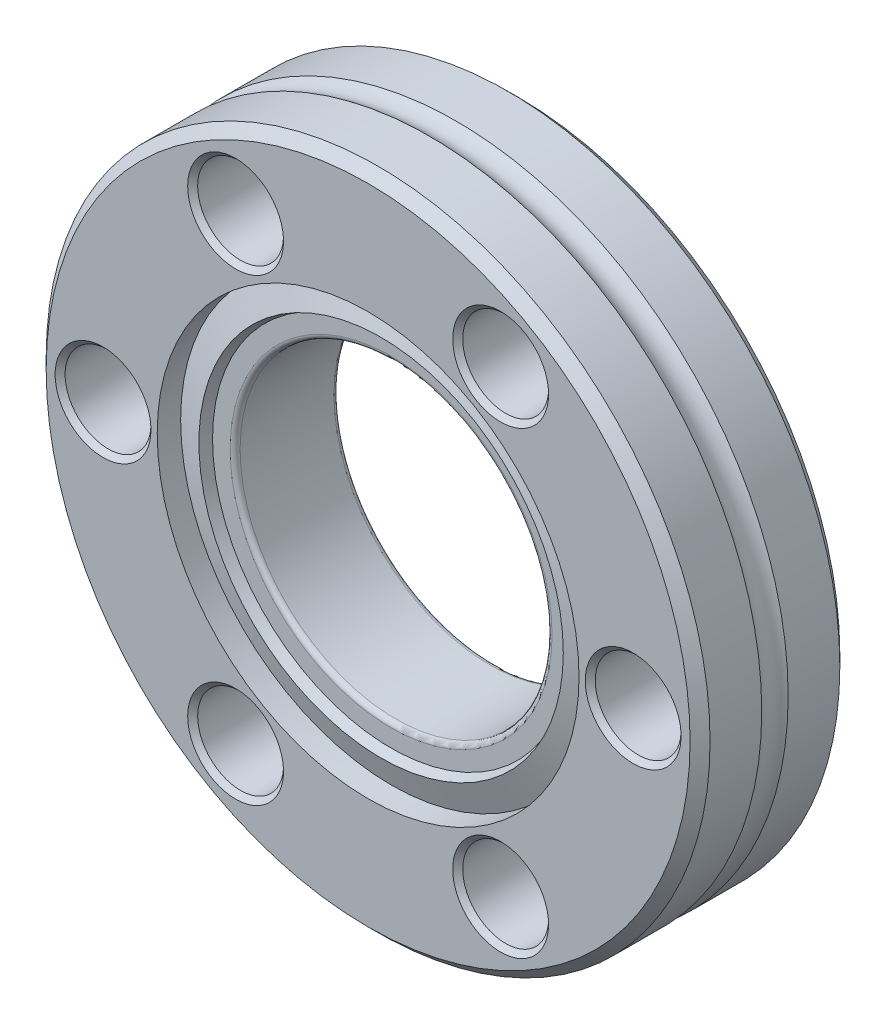
ISO-10303-21;
HEADER;
FILE_DESCRIPTION(('STEP AP214'),'2;1');
FILE_NAME('part.step','',(''),(''),'','','');
FILE_SCHEMA(('AUTOMOTIVE_DESIGN { 1 0 10303 214 1 1 1 1 }'));
ENDSEC;
DATA;
#1=APPLICATION_CONTEXT('core data for automotive mechanical design processes');
#2=APPLICATION_PROTOCOL_DEFINITION('international standard','automotive_design',2000,#1);
#3=PRODUCT_CONTEXT('',#1,'mechanical');
#4=PRODUCT('Part','Part','',(#3));
#5=PRODUCT_RELATED_PRODUCT_CATEGORY('part','',(#4));
#6=PRODUCT_DEFINITION_FORMATION('','',#4);
#7=PRODUCT_DEFINITION_CONTEXT('part definition',#1,'design');
#8=PRODUCT_DEFINITION('design','',#6,#7);
#9=PRODUCT_DEFINITION_SHAPE('','',#8);
#10=(LENGTH_UNIT() NAMED_UNIT(*) SI_UNIT(.MILLI.,.METRE.));
#11=(NAMED_UNIT(*) PLANE_ANGLE_UNIT() SI_UNIT($,.RADIAN.));
#12=(NAMED_UNIT(*) SI_UNIT($,.STERADIAN.) SOLID_ANGLE_UNIT());
#13=UNCERTAINTY_MEASURE_WITH_UNIT(LENGTH_MEASURE(1.E-05),#10,'distance_accuracy_value','');
#14=(GEOMETRIC_REPRESENTATION_CONTEXT(3) GLOBAL_UNCERTAINTY_ASSIGNED_CONTEXT((#13)) GLOBAL_UNIT_ASSIGNED_CONTEXT((#10,
#11,#12)) REPRESENTATION_CONTEXT('',''));
#15=CARTESIAN_POINT('',(0.,0.,0.));
#16=DIRECTION('',(0.,0.,1.));
#17=DIRECTION('',(1.,0.,0.));
#18=AXIS2_PLACEMENT_3D('',#15,#16,#17);
#19=CARTESIAN_POINT('',(0.,0.,3.81));
#20=DIRECTION('',(0.,0.,1.));
#21=DIRECTION('',(-1.,0.,0.));
#22=AXIS2_PLACEMENT_3D('',#19,#20,#21);
#23=CYLINDRICAL_SURFACE('',#22,16.891);
#24=CARTESIAN_POINT('',(0.,0.,-0.67202083301042));
#25=DIRECTION('',(0.,0.,-1.));
#26=DIRECTION('',(-1.,0.,0.));
#27=AXIS2_PLACEMENT_3D('',#24,#25,#26);
#28=CIRCLE('',#27,16.891);
#29=CARTESIAN_POINT('',(-16.891,0.,-0.67202083301042));
#30=VERTEX_POINT('',#29);
#31=EDGE_CURVE('E11',#30,#30,#28,.T.);
#32=ORIENTED_EDGE('',*,*,#31,.T.);
#33=EDGE_LOOP('',(#32));
#34=FACE_BOUND('',#33,.T.);
#35=CARTESIAN_POINT('',(0.,0.,-3.302));
#36=DIRECTION('',(0.,0.,1.));
#37=DIRECTION('',(-1.,0.,0.));
#38=AXIS2_PLACEMENT_3D('',#35,#36,#37);
#39=CIRCLE('',#38,16.891);
#40=CARTESIAN_POINT('',(-16.891,0.,-3.302));
#41=VERTEX_POINT('',#40);
#42=EDGE_CURVE('E28',#41,#41,#39,.T.);
#43=ORIENTED_EDGE('',*,*,#42,.T.);
#44=EDGE_LOOP('',(#43));
#45=FACE_BOUND('',#44,.T.);
#46=ADVANCED_FACE('F17',(#34,#45),#23,.T.);
#47=CARTESIAN_POINT('',(6.7437,-11.6804310310023,3.81));
#48=DIRECTION('',(0.,0.,1.));
#49=DIRECTION('',(0.5,-0.866025403784439,0.));
#50=AXIS2_PLACEMENT_3D('',#47,#48,#49);
#51=CONICAL_SURFACE('',#50,2.4384,0.785398163397442);
#52=CARTESIAN_POINT('',(6.7437,-11.6804310310023,3.81));
#53=DIRECTION('',(0.,0.,-1.));
#54=DIRECTION('',(-0.5,0.866025403784439,0.));
#55=AXIS2_PLACEMENT_3D('',#52,#53,#54);
#56=CIRCLE('',#55,2.4384);
#57=CARTESIAN_POINT('',(5.5245,-9.56871468641428,3.81));
#58=VERTEX_POINT('',#57);
#59=EDGE_CURVE('E288',#58,#58,#56,.T.);
#60=ORIENTED_EDGE('',*,*,#59,.F.);
#61=EDGE_LOOP('',(#60));
#62=FACE_BOUND('',#61,.T.);
#63=CARTESIAN_POINT('',(6.7437,-11.6804310310023,3.556));
#64=DIRECTION('',(0.,0.,1.));
#65=DIRECTION('',(-0.5,0.866025403784439,0.));
#66=AXIS2_PLACEMENT_3D('',#63,#64,#65);
#67=CIRCLE('',#66,2.1844);
#68=CARTESIAN_POINT('',(5.6515,-9.78868513897552,3.556));
#69=VERTEX_POINT('',#68);
#70=EDGE_CURVE('E205',#69,#69,#67,.T.);
#71=ORIENTED_EDGE('',*,*,#70,.F.);
#72=EDGE_LOOP('',(#71));
#73=FACE_BOUND('',#72,.T.);
#74=ADVANCED_FACE('F398',(#62,#73),#51,.F.);
#75=CARTESIAN_POINT('',(0.,0.,0.));
#76=DIRECTION('',(0.,0.,-1.));
#77=DIRECTION('',(-1.,0.,0.));
#78=AXIS2_PLACEMENT_3D('',#75,#76,#77);
#79=TOROIDAL_SURFACE('',#78,17.653,1.016);
#80=CARTESIAN_POINT('',(0.,0.,0.67202083301042));
#81=DIRECTION('',(0.,0.,-1.));
#82=DIRECTION('',(-1.,0.,0.));
#83=AXIS2_PLACEMENT_3D('',#80,#81,#82);
#84=CIRCLE('',#83,16.891);
#85=CARTESIAN_POINT('',(-16.891,0.,0.67202083301042));
#86=VERTEX_POINT('',#85);
#87=EDGE_CURVE('E235',#86,#86,#84,.T.);
#88=ORIENTED_EDGE('',*,*,#87,.T.);
#89=EDGE_LOOP('',(#88));
#90=FACE_BOUND('',#89,.T.);
#91=ORIENTED_EDGE('',*,*,#31,.F.);
#92=EDGE_LOOP('',(#91));
#93=FACE_BOUND('',#92,.T.);
#94=ADVANCED_FACE('F353',(#90,#93),#79,.F.);
#95=CARTESIAN_POINT('',(0.,0.,3.302));
#96=DIRECTION('',(0.,0.,-1.));
#97=DIRECTION('',(-1.,0.,0.));
#98=AXIS2_PLACEMENT_3D('',#95,#96,#97);
#99=CONICAL_SURFACE('',#98,16.891,0.78539816339745);
#100=CARTESIAN_POINT('',(0.,0.,3.302));
#101=DIRECTION('',(0.,0.,-1.));
#102=DIRECTION('',(-1.,0.,0.));
#103=AXIS2_PLACEMENT_3D('',#100,#101,#102);
#104=CIRCLE('',#103,16.891);
#105=CARTESIAN_POINT('',(-16.891,0.,3.302));
#106=VERTEX_POINT('',#105);
#107=EDGE_CURVE('E231',#106,#106,#104,.T.);
#108=ORIENTED_EDGE('',*,*,#107,.F.);
#109=EDGE_LOOP('',(#108));
#110=FACE_BOUND('',#109,.T.);
#111=CARTESIAN_POINT('',(0.,0.,3.81));
#112=DIRECTION('',(0.,0.,1.));
#113=DIRECTION('',(-1.,0.,0.));
#114=AXIS2_PLACEMENT_3D('',#111,#112,#113);
#115=CIRCLE('',#114,16.383);
#116=CARTESIAN_POINT('',(-16.383,0.,3.81));
#117=VERTEX_POINT('',#116);
#118=EDGE_CURVE('E283',#117,#117,#115,.T.);
#119=ORIENTED_EDGE('',*,*,#118,.F.);
#120=EDGE_LOOP('',(#119));
#121=FACE_BOUND('',#120,.T.);
#122=ADVANCED_FACE('F362',(#110,#121),#99,.T.);
#123=CARTESIAN_POINT('',(13.4874,0.,-3.81));
#124=DIRECTION('',(0.,0.,-1.));
#125=DIRECTION('',(-1.,0.,0.));
#126=AXIS2_PLACEMENT_3D('',#123,#124,#125);
#127=CONICAL_SURFACE('',#126,2.4384,0.785398163397442);
#128=CARTESIAN_POINT('',(13.4874,0.,-3.81));
#129=DIRECTION('',(0.,0.,1.));
#130=DIRECTION('',(-1.,0.,0.));
#131=AXIS2_PLACEMENT_3D('',#128,#129,#130);
#132=CIRCLE('',#131,2.4384);
#133=CARTESIAN_POINT('',(11.049,0.,-3.81));
#134=VERTEX_POINT('',#133);
#135=EDGE_CURVE('E260',#134,#134,#132,.T.);
#136=ORIENTED_EDGE('',*,*,#135,.F.);
#137=EDGE_LOOP('',(#136));
#138=FACE_BOUND('',#137,.T.);
#139=CARTESIAN_POINT('',(13.4874,0.,-3.556));
#140=DIRECTION('',(0.,0.,-1.));
#141=DIRECTION('',(-1.,0.,0.));
#142=AXIS2_PLACEMENT_3D('',#139,#140,#141);
#143=CIRCLE('',#142,2.1844);
#144=CARTESIAN_POINT('',(11.303,0.,-3.556));
#145=VERTEX_POINT('',#144);
#146=EDGE_CURVE('E194',#145,#145,#143,.T.);
#147=ORIENTED_EDGE('',*,*,#146,.F.);
#148=EDGE_LOOP('',(#147));
#149=FACE_BOUND('',#148,.T.);
#150=ADVANCED_FACE('F359',(#138,#149),#127,.F.);
#151=CARTESIAN_POINT('',(0.,0.,3.81));
#152=DIRECTION('',(0.,0.,1.));
#153=DIRECTION('',(-1.,0.,0.));
#154=AXIS2_PLACEMENT_3D('',#151,#152,#153);
#155=CYLINDRICAL_SURFACE('',#154,16.891);
#156=ORIENTED_EDGE('',*,*,#87,.F.);
#157=EDGE_LOOP('',(#156));
#158=FACE_BOUND('',#157,.T.);
#159=ORIENTED_EDGE('',*,*,#107,.T.);
#160=EDGE_LOOP('',(#159));
#161=FACE_BOUND('',#160,.T.);
#162=ADVANCED_FACE('F355',(#158,#161),#155,.T.);
#163=CARTESIAN_POINT('',(0.,0.,2.6416));
#164=DIRECTION('',(0.,0.,1.));
#165=DIRECTION('',(1.,0.,0.));
#166=AXIS2_PLACEMENT_3D('',#163,#164,#165);
#167=PLANE('',#166);
#168=CARTESIAN_POINT('',(0.,0.,2.6416));
#169=DIRECTION('',(0.,0.,1.));
#170=DIRECTION('',(1.,0.,0.));
#171=AXIS2_PLACEMENT_3D('',#168,#169,#170);
#172=CIRCLE('',#171,9.08610312099276);
#173=CARTESIAN_POINT('',(9.08610312099276,0.,2.6416));
#174=VERTEX_POINT('',#173);
#175=EDGE_CURVE('E236',#174,#174,#172,.T.);
#176=ORIENTED_EDGE('',*,*,#175,.T.);
#177=EDGE_LOOP('',(#176));
#178=FACE_BOUND('',#177,.T.);
#179=CARTESIAN_POINT('',(0.,0.,2.6416));
#180=DIRECTION('',(0.,0.,-1.));
#181=DIRECTION('',(1.,0.,0.));
#182=AXIS2_PLACEMENT_3D('',#179,#180,#181);
#183=CIRCLE('',#182,8.1915);
#184=CARTESIAN_POINT('',(8.1915,0.,2.6416));
#185=VERTEX_POINT('',#184);
#186=EDGE_CURVE('E241',#185,#185,#183,.T.);
#187=ORIENTED_EDGE('',*,*,#186,.T.);
#188=EDGE_LOOP('',(#187));
#189=FACE_BOUND('',#188,.T.);
#190=ADVANCED_FACE('F358',(#178,#189),#167,.T.);
#191=CARTESIAN_POINT('',(0.,0.,48.3788326440397));
#192=DIRECTION('',(0.,0.,1.));
#193=DIRECTION('',(-1.,0.,0.));
#194=AXIS2_PLACEMENT_3D('',#191,#192,#193);
#195=CYLINDRICAL_SURFACE('',#194,7.9375);
#196=CARTESIAN_POINT('',(0.,0.,-2.3876));
#197=DIRECTION('',(0.,0.,-1.));
#198=DIRECTION('',(1.,0.,0.));
#199=AXIS2_PLACEMENT_3D('',#196,#197,#198);
#200=CIRCLE('',#199,7.9375);
#201=CARTESIAN_POINT('',(7.9375,0.,-2.3876));
#202=VERTEX_POINT('',#201);
#203=EDGE_CURVE('E245',#202,#202,#200,.T.);
#204=ORIENTED_EDGE('',*,*,#203,.T.);
#205=EDGE_LOOP('',(#204));
#206=FACE_BOUND('',#205,.T.);
#207=CARTESIAN_POINT('',(0.,0.,2.3876));
#208=DIRECTION('',(0.,0.,1.));
#209=DIRECTION('',(1.,0.,0.));
#210=AXIS2_PLACEMENT_3D('',#207,#208,#209);
#211=CIRCLE('',#210,7.9375);
#212=CARTESIAN_POINT('',(7.9375,0.,2.3876));
#213=VERTEX_POINT('',#212);
#214=EDGE_CURVE('E317',#213,#213,#211,.T.);
#215=ORIENTED_EDGE('',*,*,#214,.T.);
#216=EDGE_LOOP('',(#215));
#217=FACE_BOUND('',#216,.T.);
#218=ADVANCED_FACE('F721',(#206,#217),#195,.F.);
#219=CARTESIAN_POINT('',(0.,0.,2.6416));
#220=DIRECTION('',(0.,0.,1.));
#221=DIRECTION('',(1.,0.,0.));
#222=AXIS2_PLACEMENT_3D('',#219,#220,#221);
#223=CONICAL_SURFACE('',#222,9.08610312099276,0.349065850398891);
#224=CARTESIAN_POINT('',(0.,0.,3.1496));
#225=DIRECTION('',(0.,0.,1.));
#226=DIRECTION('',(1.,0.,0.));
#227=AXIS2_PLACEMENT_3D('',#224,#225,#226);
#228=CIRCLE('',#227,9.271);
#229=CARTESIAN_POINT('',(9.271,0.,3.1496));
#230=VERTEX_POINT('',#229);
#231=EDGE_CURVE('E287',#230,#230,#228,.T.);
#232=ORIENTED_EDGE('',*,*,#231,.T.);
#233=EDGE_LOOP('',(#232));
#234=FACE_BOUND('',#233,.T.);
#235=ORIENTED_EDGE('',*,*,#175,.F.);
#236=EDGE_LOOP('',(#235));
#237=FACE_BOUND('',#236,.T.);
#238=ADVANCED_FACE('F369',(#234,#237),#223,.F.);
#239=CARTESIAN_POINT('',(0.,0.,3.81));
#240=DIRECTION('',(0.,0.,-1.));
#241=DIRECTION('',(0.,-1.,0.));
#242=AXIS2_PLACEMENT_3D('',#239,#240,#241);
#243=PLANE('',#242);
#244=ORIENTED_EDGE('',*,*,#118,.T.);
#245=EDGE_LOOP('',(#244));
#246=FACE_BOUND('',#245,.T.);
#247=ORIENTED_EDGE('',*,*,#59,.T.);
#248=EDGE_LOOP('',(#247));
#249=FACE_BOUND('',#248,.T.);
#250=CARTESIAN_POINT('',(-6.7437,-11.6804310310022,3.81));
#251=DIRECTION('',(0.,0.,-1.));
#252=DIRECTION('',(0.5,0.866025403784439,0.));
#253=AXIS2_PLACEMENT_3D('',#250,#251,#252);
#254=CIRCLE('',#253,2.4384);
#255=CARTESIAN_POINT('',(-5.5245,-9.56871468641427,3.81));
#256=VERTEX_POINT('',#255);
#257=EDGE_CURVE('E257',#256,#256,#254,.T.);
#258=ORIENTED_EDGE('',*,*,#257,.T.);
#259=EDGE_LOOP('',(#258));
#260=FACE_BOUND('',#259,.T.);
#261=CARTESIAN_POINT('',(-13.4874,0.,3.81));
#262=DIRECTION('',(0.,0.,-1.));
#263=DIRECTION('',(1.,0.,0.));
#264=AXIS2_PLACEMENT_3D('',#261,#262,#263);
#265=CIRCLE('',#264,2.4384);
#266=CARTESIAN_POINT('',(-11.049,0.,3.81));
#267=VERTEX_POINT('',#266);
#268=EDGE_CURVE('E254',#267,#267,#265,.T.);
#269=ORIENTED_EDGE('',*,*,#268,.T.);
#270=EDGE_LOOP('',(#269));
#271=FACE_BOUND('',#270,.T.);
#272=CARTESIAN_POINT('',(-6.7437,11.6804310310022,3.81));
#273=DIRECTION('',(0.,0.,-1.));
#274=DIRECTION('',(0.5,-0.866025403784439,0.));
#275=AXIS2_PLACEMENT_3D('',#272,#273,#274);
#276=CIRCLE('',#275,2.4384);
#277=CARTESIAN_POINT('',(-5.5245,9.56871468641427,3.81));
#278=VERTEX_POINT('',#277);
#279=EDGE_CURVE('E258',#278,#278,#276,.T.);
#280=ORIENTED_EDGE('',*,*,#279,.T.);
#281=EDGE_LOOP('',(#280));
#282=FACE_BOUND('',#281,.T.);
#283=CARTESIAN_POINT('',(6.7437,11.6804310310022,3.81));
#284=DIRECTION('',(0.,0.,-1.));
#285=DIRECTION('',(-0.5,-0.866025403784439,0.));
#286=AXIS2_PLACEMENT_3D('',#283,#284,#285);
#287=CIRCLE('',#286,2.4384);
#288=CARTESIAN_POINT('',(5.5245,9.56871468641427,3.81));
#289=VERTEX_POINT('',#288);
#290=EDGE_CURVE('E295',#289,#289,#287,.T.);
#291=ORIENTED_EDGE('',*,*,#290,.T.);
#292=EDGE_LOOP('',(#291));
#293=FACE_BOUND('',#292,.T.);
#294=CARTESIAN_POINT('',(13.4874,0.,3.81));
#295=DIRECTION('',(0.,0.,-1.));
#296=DIRECTION('',(-1.,0.,0.));
#297=AXIS2_PLACEMENT_3D('',#294,#295,#296);
#298=CIRCLE('',#297,2.4384);
#299=CARTESIAN_POINT('',(11.049,0.,3.81));
#300=VERTEX_POINT('',#299);
#301=EDGE_CURVE('E300',#300,#300,#298,.T.);
#302=ORIENTED_EDGE('',*,*,#301,.T.);
#303=EDGE_LOOP('',(#302));
#304=FACE_BOUND('',#303,.T.);
#305=CARTESIAN_POINT('',(0.,0.,3.81));
#306=DIRECTION('',(0.,0.,1.));
#307=DIRECTION('',(1.,0.,0.));
#308=AXIS2_PLACEMENT_3D('',#305,#306,#307);
#309=CIRCLE('',#308,10.7315);
#310=CARTESIAN_POINT('',(10.7315,0.,3.81));
#311=VERTEX_POINT('',#310);
#312=EDGE_CURVE('E210',#311,#311,#309,.T.);
#313=ORIENTED_EDGE('',*,*,#312,.F.);
#314=EDGE_LOOP('',(#313));
#315=FACE_BOUND('',#314,.T.);
#316=ADVANCED_FACE('F19',(#246,#249,#260,#271,#282,#293,#304,#315),#243,.F.);
#317=CARTESIAN_POINT('',(6.7437,-11.6804310310023,-3.81));
#318=DIRECTION('',(0.,0.,-1.));
#319=DIRECTION('',(-0.5,0.866025403784439,0.));
#320=AXIS2_PLACEMENT_3D('',#317,#318,#319);
#321=CONICAL_SURFACE('',#320,2.4384,0.785398163397442);
#322=CARTESIAN_POINT('',(6.7437,-11.6804310310023,-3.81));
#323=DIRECTION('',(0.,0.,1.));
#324=DIRECTION('',(-0.5,0.866025403784439,0.));
#325=AXIS2_PLACEMENT_3D('',#322,#323,#324);
#326=CIRCLE('',#325,2.4384);
#327=CARTESIAN_POINT('',(5.5245,-9.56871468641428,-3.81));
#328=VERTEX_POINT('',#327);
#329=EDGE_CURVE('E301',#328,#328,#326,.T.);
#330=ORIENTED_EDGE('',*,*,#329,.F.);
#331=EDGE_LOOP('',(#330));
#332=FACE_BOUND('',#331,.T.);
#333=CARTESIAN_POINT('',(6.7437,-11.6804310310023,-3.556));
#334=DIRECTION('',(0.,0.,-1.));
#335=DIRECTION('',(-0.5,0.866025403784439,0.));
#336=AXIS2_PLACEMENT_3D('',#333,#334,#335);
#337=CIRCLE('',#336,2.1844);
#338=CARTESIAN_POINT('',(5.6515,-9.78868513897552,-3.556));
#339=VERTEX_POINT('',#338);
#340=EDGE_CURVE('E195',#339,#339,#337,.T.);
#341=ORIENTED_EDGE('',*,*,#340,.F.);
#342=EDGE_LOOP('',(#341));
#343=FACE_BOUND('',#342,.T.);
#344=ADVANCED_FACE('F368',(#332,#343),#321,.F.);
#345=CARTESIAN_POINT('',(0.,0.,-3.81));
#346=DIRECTION('',(0.,0.,1.));
#347=DIRECTION('',(1.,0.,0.));
#348=AXIS2_PLACEMENT_3D('',#345,#346,#347);
#349=CONICAL_SURFACE('',#348,16.383,0.785398163397449);
#350=ORIENTED_EDGE('',*,*,#42,.F.);
#351=EDGE_LOOP('',(#350));
#352=FACE_BOUND('',#351,.T.);
#353=CARTESIAN_POINT('',(0.,0.,-3.81));
#354=DIRECTION('',(0.,0.,-1.));
#355=DIRECTION('',(-1.,0.,0.));
#356=AXIS2_PLACEMENT_3D('',#353,#354,#355);
#357=CIRCLE('',#356,16.383);
#358=CARTESIAN_POINT('',(-16.383,0.,-3.81));
#359=VERTEX_POINT('',#358);
#360=EDGE_CURVE('E296',#359,#359,#357,.T.);
#361=ORIENTED_EDGE('',*,*,#360,.F.);
#362=EDGE_LOOP('',(#361));
#363=FACE_BOUND('',#362,.T.);
#364=ADVANCED_FACE('F685',(#352,#363),#349,.T.);
#365=CARTESIAN_POINT('',(0.,0.,-2.3876));
#366=DIRECTION('',(0.,0.,1.));
#367=DIRECTION('',(1.,0.,0.));
#368=AXIS2_PLACEMENT_3D('',#365,#366,#367);
#369=TOROIDAL_SURFACE('',#368,8.1915,0.254);
#370=ORIENTED_EDGE('',*,*,#203,.F.);
#371=EDGE_LOOP('',(#370));
#372=FACE_BOUND('',#371,.T.);
#373=CARTESIAN_POINT('',(0.,0.,-2.6416));
#374=DIRECTION('',(0.,0.,1.));
#375=DIRECTION('',(1.,0.,0.));
#376=AXIS2_PLACEMENT_3D('',#373,#374,#375);
#377=CIRCLE('',#376,8.1915);
#378=CARTESIAN_POINT('',(8.1915,0.,-2.6416));
#379=VERTEX_POINT('',#378);
#380=EDGE_CURVE('E220',#379,#379,#377,.T.);
#381=ORIENTED_EDGE('',*,*,#380,.F.);
#382=EDGE_LOOP('',(#381));
#383=FACE_BOUND('',#382,.T.);
#384=ADVANCED_FACE('F674',(#372,#383),#369,.T.);
#385=CARTESIAN_POINT('',(0.,0.,-3.81));
#386=DIRECTION('',(0.,0.,-1.));
#387=DIRECTION('',(0.,-1.,0.));
#388=AXIS2_PLACEMENT_3D('',#385,#386,#387);
#389=PLANE('',#388);
#390=ORIENTED_EDGE('',*,*,#360,.T.);
#391=EDGE_LOOP('',(#390));
#392=FACE_BOUND('',#391,.T.);
#393=ORIENTED_EDGE('',*,*,#329,.T.);
#394=EDGE_LOOP('',(#393));
#395=FACE_BOUND('',#394,.T.);
#396=CARTESIAN_POINT('',(-6.7437,-11.6804310310022,-3.81));
#397=DIRECTION('',(0.,0.,1.));
#398=DIRECTION('',(0.5,0.866025403784439,0.));
#399=AXIS2_PLACEMENT_3D('',#396,#397,#398);
#400=CIRCLE('',#399,2.4384);
#401=CARTESIAN_POINT('',(-5.5245,-9.56871468641427,-3.81));
#402=VERTEX_POINT('',#401);
#403=EDGE_CURVE('E272',#402,#402,#400,.T.);
#404=ORIENTED_EDGE('',*,*,#403,.T.);
#405=EDGE_LOOP('',(#404));
#406=FACE_BOUND('',#405,.T.);
#407=CARTESIAN_POINT('',(-13.4874,0.,-3.81));
#408=DIRECTION('',(0.,0.,1.));
#409=DIRECTION('',(1.,0.,0.));
#410=AXIS2_PLACEMENT_3D('',#407,#408,#409);
#411=CIRCLE('',#410,2.4384);
#412=CARTESIAN_POINT('',(-11.049,0.,-3.81));
#413=VERTEX_POINT('',#412);
#414=EDGE_CURVE('E214',#413,#413,#411,.T.);
#415=ORIENTED_EDGE('',*,*,#414,.T.);
#416=EDGE_LOOP('',(#415));
#417=FACE_BOUND('',#416,.T.);
#418=CARTESIAN_POINT('',(-6.7437,11.6804310310022,-3.81));
#419=DIRECTION('',(0.,0.,1.));
#420=DIRECTION('',(0.5,-0.866025403784439,0.));
#421=AXIS2_PLACEMENT_3D('',#418,#419,#420);
#422=CIRCLE('',#421,2.4384);
#423=CARTESIAN_POINT('',(-5.5245,9.56871468641427,-3.81));
#424=VERTEX_POINT('',#423);
#425=EDGE_CURVE('E211',#424,#424,#422,.T.);
#426=ORIENTED_EDGE('',*,*,#425,.T.);
#427=EDGE_LOOP('',(#426));
#428=FACE_BOUND('',#427,.T.);
#429=CARTESIAN_POINT('',(6.7437,11.6804310310022,-3.81));
#430=DIRECTION('',(0.,0.,1.));
#431=DIRECTION('',(-0.5,-0.866025403784439,0.));
#432=AXIS2_PLACEMENT_3D('',#429,#430,#431);
#433=CIRCLE('',#432,2.4384);
#434=CARTESIAN_POINT('',(5.5245,9.56871468641427,-3.81));
#435=VERTEX_POINT('',#434);
#436=EDGE_CURVE('E21',#435,#435,#433,.T.);
#437=ORIENTED_EDGE('',*,*,#436,.T.);
#438=EDGE_LOOP('',(#437));
#439=FACE_BOUND('',#438,.T.);
#440=ORIENTED_EDGE('',*,*,#135,.T.);
#441=EDGE_LOOP('',(#440));
#442=FACE_BOUND('',#441,.T.);
#443=CARTESIAN_POINT('',(0.,0.,-3.81));
#444=DIRECTION('',(0.,0.,-1.));
#445=DIRECTION('',(-1.,0.,0.));
#446=AXIS2_PLACEMENT_3D('',#443,#444,#445);
#447=CIRCLE('',#446,10.7188);
#448=CARTESIAN_POINT('',(-10.7188,0.,-3.81));
#449=VERTEX_POINT('',#448);
#450=EDGE_CURVE('E221',#449,#449,#447,.T.);
#451=ORIENTED_EDGE('',*,*,#450,.F.);
#452=EDGE_LOOP('',(#451));
#453=FACE_BOUND('',#452,.T.);
#454=ADVANCED_FACE('F664',(#392,#395,#406,#417,#428,#439,#442,#453),#389,.T.);
#455=CARTESIAN_POINT('',(6.7437,11.6804310310022,48.3788326440397));
#456=DIRECTION('',(0.,0.,1.));
#457=DIRECTION('',(-0.5,-0.866025403784439,0.));
#458=AXIS2_PLACEMENT_3D('',#455,#456,#457);
#459=CYLINDRICAL_SURFACE('',#458,2.1844);
#460=CARTESIAN_POINT('',(6.7437,11.6804310310022,-3.556));
#461=DIRECTION('',(0.,0.,-1.));
#462=DIRECTION('',(-0.5,-0.866025403784439,0.));
#463=AXIS2_PLACEMENT_3D('',#460,#461,#462);
#464=CIRCLE('',#463,2.1844);
#465=CARTESIAN_POINT('',(5.6515,9.78868513897552,-3.556));
#466=VERTEX_POINT('',#465);
#467=EDGE_CURVE('E253',#466,#466,#464,.T.);
#468=ORIENTED_EDGE('',*,*,#467,.T.);
#469=EDGE_LOOP('',(#468));
#470=FACE_BOUND('',#469,.T.);
#471=CARTESIAN_POINT('',(6.7437,11.6804310310022,3.556));
#472=DIRECTION('',(0.,0.,1.));
#473=DIRECTION('',(-0.5,-0.866025403784439,0.));
#474=AXIS2_PLACEMENT_3D('',#471,#472,#473);
#475=CIRCLE('',#474,2.1844);
#476=CARTESIAN_POINT('',(5.6515,9.78868513897552,3.556));
#477=VERTEX_POINT('',#476);
#478=EDGE_CURVE('E224',#477,#477,#475,.T.);
#479=ORIENTED_EDGE('',*,*,#478,.T.);
#480=EDGE_LOOP('',(#479));
#481=FACE_BOUND('',#480,.T.);
#482=ADVANCED_FACE('F425',(#470,#481),#459,.F.);
#483=CARTESIAN_POINT('',(0.,0.,54.));
#484=DIRECTION('',(0.,0.,1.));
#485=DIRECTION('',(-1.,0.,0.));
#486=AXIS2_PLACEMENT_3D('',#483,#484,#485);
#487=CYLINDRICAL_SURFACE('',#486,10.7188);
#488=ORIENTED_EDGE('',*,*,#450,.T.);
#489=EDGE_LOOP('',(#488));
#490=FACE_BOUND('',#489,.T.);
#491=CARTESIAN_POINT('',(0.,0.,-2.62264389482939));
#492=DIRECTION('',(0.,0.,-1.));
#493=DIRECTION('',(-1.,0.,0.));
#494=AXIS2_PLACEMENT_3D('',#491,#492,#493);
#495=CIRCLE('',#494,10.7188);
#496=CARTESIAN_POINT('',(-10.7188,0.,-2.62264389482939));
#497=VERTEX_POINT('',#496);
#498=EDGE_CURVE('E225',#497,#497,#495,.T.);
#499=ORIENTED_EDGE('',*,*,#498,.F.);
#500=EDGE_LOOP('',(#499));
#501=FACE_BOUND('',#500,.T.);
#502=ADVANCED_FACE('F422',(#490,#501),#487,.F.);
#503=CARTESIAN_POINT('',(0.,0.,-2.62264389482939));
#504=DIRECTION('',(0.,0.,1.));
#505=DIRECTION('',(1.,0.,0.));
#506=AXIS2_PLACEMENT_3D('',#503,#504,#505);
#507=CONICAL_SURFACE('',#506,10.7188,1.22173047639603);
#508=ORIENTED_EDGE('',*,*,#498,.T.);
#509=EDGE_LOOP('',(#508));
#510=FACE_BOUND('',#509,.T.);
#511=CARTESIAN_POINT('',(0.,0.,-3.1496));
#512=DIRECTION('',(0.,0.,-1.));
#513=DIRECTION('',(-1.,0.,0.));
#514=AXIS2_PLACEMENT_3D('',#511,#512,#513);
#515=CIRCLE('',#514,9.271);
#516=CARTESIAN_POINT('',(-9.271,0.,-3.1496));
#517=VERTEX_POINT('',#516);
#518=EDGE_CURVE('E216',#517,#517,#515,.T.);
#519=ORIENTED_EDGE('',*,*,#518,.F.);
#520=EDGE_LOOP('',(#519));
#521=FACE_BOUND('',#520,.T.);
#522=ADVANCED_FACE('F424',(#510,#521),#507,.T.);
#523=CARTESIAN_POINT('',(0.,0.,-2.6416));
#524=DIRECTION('',(0.,0.,1.));
#525=DIRECTION('',(1.,0.,0.));
#526=AXIS2_PLACEMENT_3D('',#523,#524,#525);
#527=PLANE('',#526);
#528=CARTESIAN_POINT('',(0.,0.,-2.6416));
#529=DIRECTION('',(0.,0.,-1.));
#530=DIRECTION('',(-1.,0.,0.));
#531=AXIS2_PLACEMENT_3D('',#528,#529,#530);
#532=CIRCLE('',#531,9.0861031209928);
#533=CARTESIAN_POINT('',(-9.0861031209928,0.,-2.6416));
#534=VERTEX_POINT('',#533);
#535=EDGE_CURVE('E249',#534,#534,#532,.T.);
#536=ORIENTED_EDGE('',*,*,#535,.T.);
#537=EDGE_LOOP('',(#536));
#538=FACE_BOUND('',#537,.T.);
#539=ORIENTED_EDGE('',*,*,#380,.T.);
#540=EDGE_LOOP('',(#539));
#541=FACE_BOUND('',#540,.T.);
#542=ADVANCED_FACE('F392',(#538,#541),#527,.F.);
#543=CARTESIAN_POINT('',(0.,0.,-3.1496));
#544=DIRECTION('',(0.,0.,-1.));
#545=DIRECTION('',(-1.,0.,0.));
#546=AXIS2_PLACEMENT_3D('',#543,#544,#545);
#547=CONICAL_SURFACE('',#546,9.271,0.349065850398819);
#548=ORIENTED_EDGE('',*,*,#518,.T.);
#549=EDGE_LOOP('',(#548));
#550=FACE_BOUND('',#549,.T.);
#551=ORIENTED_EDGE('',*,*,#535,.F.);
#552=EDGE_LOOP('',(#551));
#553=FACE_BOUND('',#552,.T.);
#554=ADVANCED_FACE('F382',(#550,#553),#547,.F.);
#555=CARTESIAN_POINT('',(0.,0.,54.));
#556=DIRECTION('',(0.,0.,-1.));
#557=DIRECTION('',(1.,0.,0.));
#558=AXIS2_PLACEMENT_3D('',#555,#556,#557);
#559=CYLINDRICAL_SURFACE('',#558,10.7315);
#560=CARTESIAN_POINT('',(0.,0.,2.61802147285421));
#561=DIRECTION('',(0.,0.,1.));
#562=DIRECTION('',(1.,0.,0.));
#563=AXIS2_PLACEMENT_3D('',#560,#561,#562);
#564=CIRCLE('',#563,10.7315);
#565=CARTESIAN_POINT('',(10.7315,0.,2.61802147285421));
#566=VERTEX_POINT('',#565);
#567=EDGE_CURVE('E201',#566,#566,#564,.T.);
#568=ORIENTED_EDGE('',*,*,#567,.F.);
#569=EDGE_LOOP('',(#568));
#570=FACE_BOUND('',#569,.T.);
#571=ORIENTED_EDGE('',*,*,#312,.T.);
#572=EDGE_LOOP('',(#571));
#573=FACE_BOUND('',#572,.T.);
#574=ADVANCED_FACE('F379',(#570,#573),#559,.F.);
#575=CARTESIAN_POINT('',(0.,0.,3.1496));
#576=DIRECTION('',(0.,0.,-1.));
#577=DIRECTION('',(-1.,0.,0.));
#578=AXIS2_PLACEMENT_3D('',#575,#576,#577);
#579=CONICAL_SURFACE('',#578,9.271,1.22173047639603);
#580=ORIENTED_EDGE('',*,*,#567,.T.);
#581=EDGE_LOOP('',(#580));
#582=FACE_BOUND('',#581,.T.);
#583=ORIENTED_EDGE('',*,*,#231,.F.);
#584=EDGE_LOOP('',(#583));
#585=FACE_BOUND('',#584,.T.);
#586=ADVANCED_FACE('F381',(#582,#585),#579,.T.);
#587=CARTESIAN_POINT('',(13.4874,0.,3.81));
#588=DIRECTION('',(0.,0.,1.));
#589=DIRECTION('',(1.,0.,0.));
#590=AXIS2_PLACEMENT_3D('',#587,#588,#589);
#591=CONICAL_SURFACE('',#590,2.4384,0.785398163397442);
#592=ORIENTED_EDGE('',*,*,#301,.F.);
#593=EDGE_LOOP('',(#592));
#594=FACE_BOUND('',#593,.T.);
#595=CARTESIAN_POINT('',(13.4874,0.,3.556));
#596=DIRECTION('',(0.,0.,1.));
#597=DIRECTION('',(-1.,0.,0.));
#598=AXIS2_PLACEMENT_3D('',#595,#596,#597);
#599=CIRCLE('',#598,2.1844);
#600=CARTESIAN_POINT('',(11.303,0.,3.556));
#601=VERTEX_POINT('',#600);
#602=EDGE_CURVE('E190',#601,#601,#599,.T.);
#603=ORIENTED_EDGE('',*,*,#602,.F.);
#604=EDGE_LOOP('',(#603));
#605=FACE_BOUND('',#604,.T.);
#606=ADVANCED_FACE('F191',(#594,#605),#591,.F.);
#607=CARTESIAN_POINT('',(13.4874,0.,48.3788326440397));
#608=DIRECTION('',(0.,0.,1.));
#609=DIRECTION('',(-1.,0.,0.));
#610=AXIS2_PLACEMENT_3D('',#607,#608,#609);
#611=CYLINDRICAL_SURFACE('',#610,2.1844);
#612=ORIENTED_EDGE('',*,*,#146,.T.);
#613=EDGE_LOOP('',(#612));
#614=FACE_BOUND('',#613,.T.);
#615=ORIENTED_EDGE('',*,*,#602,.T.);
#616=EDGE_LOOP('',(#615));
#617=FACE_BOUND('',#616,.T.);
#618=ADVANCED_FACE('F411',(#614,#617),#611,.F.);
#619=CARTESIAN_POINT('',(6.7437,-11.6804310310023,48.3788326440397));
#620=DIRECTION('',(0.,0.,1.));
#621=DIRECTION('',(-0.5,0.866025403784439,0.));
#622=AXIS2_PLACEMENT_3D('',#619,#620,#621);
#623=CYLINDRICAL_SURFACE('',#622,2.1844);
#624=ORIENTED_EDGE('',*,*,#340,.T.);
#625=EDGE_LOOP('',(#624));
#626=FACE_BOUND('',#625,.T.);
#627=ORIENTED_EDGE('',*,*,#70,.T.);
#628=EDGE_LOOP('',(#627));
#629=FACE_BOUND('',#628,.T.);
#630=ADVANCED_FACE('F413',(#626,#629),#623,.F.);
#631=CARTESIAN_POINT('',(-6.7437,-11.6804310310022,3.81));
#632=DIRECTION('',(0.,0.,1.));
#633=DIRECTION('',(-0.5,-0.866025403784439,0.));
#634=AXIS2_PLACEMENT_3D('',#631,#632,#633);
#635=CONICAL_SURFACE('',#634,2.4384,0.785398163397442);
#636=ORIENTED_EDGE('',*,*,#257,.F.);
#637=EDGE_LOOP('',(#636));
#638=FACE_BOUND('',#637,.T.);
#639=CARTESIAN_POINT('',(-6.7437,-11.6804310310022,3.556));
#640=DIRECTION('',(0.,0.,1.));
#641=DIRECTION('',(0.5,0.866025403784439,0.));
#642=AXIS2_PLACEMENT_3D('',#639,#640,#641);
#643=CIRCLE('',#642,2.1844);
#644=CARTESIAN_POINT('',(-5.6515,-9.78868513897552,3.556));
#645=VERTEX_POINT('',#644);
#646=EDGE_CURVE('E240',#645,#645,#643,.T.);
#647=ORIENTED_EDGE('',*,*,#646,.F.);
#648=EDGE_LOOP('',(#647));
#649=FACE_BOUND('',#648,.T.);
#650=ADVANCED_FACE('F445',(#638,#649),#635,.F.);
#651=CARTESIAN_POINT('',(-6.7437,-11.6804310310022,-3.81));
#652=DIRECTION('',(0.,0.,-1.));
#653=DIRECTION('',(0.5,0.866025403784439,0.));
#654=AXIS2_PLACEMENT_3D('',#651,#652,#653);
#655=CONICAL_SURFACE('',#654,2.4384,0.785398163397442);
#656=ORIENTED_EDGE('',*,*,#403,.F.);
#657=EDGE_LOOP('',(#656));
#658=FACE_BOUND('',#657,.T.);
#659=CARTESIAN_POINT('',(-6.7437,-11.6804310310022,-3.556));
#660=DIRECTION('',(0.,0.,-1.));
#661=DIRECTION('',(0.5,0.866025403784439,0.));
#662=AXIS2_PLACEMENT_3D('',#659,#660,#661);
#663=CIRCLE('',#662,2.1844);
#664=CARTESIAN_POINT('',(-5.6515,-9.78868513897552,-3.556));
#665=VERTEX_POINT('',#664);
#666=EDGE_CURVE('E230',#665,#665,#663,.T.);
#667=ORIENTED_EDGE('',*,*,#666,.F.);
#668=EDGE_LOOP('',(#667));
#669=FACE_BOUND('',#668,.T.);
#670=ADVANCED_FACE('F409',(#658,#669),#655,.F.);
#671=CARTESIAN_POINT('',(-6.7437,-11.6804310310022,48.3788326440397));
#672=DIRECTION('',(0.,0.,1.));
#673=DIRECTION('',(0.5,0.866025403784439,0.));
#674=AXIS2_PLACEMENT_3D('',#671,#672,#673);
#675=CYLINDRICAL_SURFACE('',#674,2.1844);
#676=ORIENTED_EDGE('',*,*,#666,.T.);
#677=EDGE_LOOP('',(#676));
#678=FACE_BOUND('',#677,.T.);
#679=ORIENTED_EDGE('',*,*,#646,.T.);
#680=EDGE_LOOP('',(#679));
#681=FACE_BOUND('',#680,.T.);
#682=ADVANCED_FACE('F460',(#678,#681),#675,.F.);
#683=CARTESIAN_POINT('',(-13.4874,0.,3.81));
#684=DIRECTION('',(0.,0.,1.));
#685=DIRECTION('',(-1.,0.,0.));
#686=AXIS2_PLACEMENT_3D('',#683,#684,#685);
#687=CONICAL_SURFACE('',#686,2.4384,0.785398163397442);
#688=ORIENTED_EDGE('',*,*,#268,.F.);
#689=EDGE_LOOP('',(#688));
#690=FACE_BOUND('',#689,.T.);
#691=CARTESIAN_POINT('',(-13.4874,0.,3.556));
#692=DIRECTION('',(0.,0.,1.));
#693=DIRECTION('',(1.,0.,0.));
#694=AXIS2_PLACEMENT_3D('',#691,#692,#693);
#695=CIRCLE('',#694,2.1844);
#696=CARTESIAN_POINT('',(-11.303,0.,3.556));
#697=VERTEX_POINT('',#696);
#698=EDGE_CURVE('E268',#697,#697,#695,.T.);
#699=ORIENTED_EDGE('',*,*,#698,.F.);
#700=EDGE_LOOP('',(#699));
#701=FACE_BOUND('',#700,.T.);
#702=ADVANCED_FACE('F419',(#690,#701),#687,.F.);
#703=CARTESIAN_POINT('',(-13.4874,0.,-3.81));
#704=DIRECTION('',(0.,0.,-1.));
#705=DIRECTION('',(1.,0.,0.));
#706=AXIS2_PLACEMENT_3D('',#703,#704,#705);
#707=CONICAL_SURFACE('',#706,2.4384,0.785398163397442);
#708=ORIENTED_EDGE('',*,*,#414,.F.);
#709=EDGE_LOOP('',(#708));
#710=FACE_BOUND('',#709,.T.);
#711=CARTESIAN_POINT('',(-13.4874,0.,-3.556));
#712=DIRECTION('',(0.,0.,-1.));
#713=DIRECTION('',(1.,0.,0.));
#714=AXIS2_PLACEMENT_3D('',#711,#712,#713);
#715=CIRCLE('',#714,2.1844);
#716=CARTESIAN_POINT('',(-11.303,0.,-3.556));
#717=VERTEX_POINT('',#716);
#718=EDGE_CURVE('E264',#717,#717,#715,.T.);
#719=ORIENTED_EDGE('',*,*,#718,.F.);
#720=EDGE_LOOP('',(#719));
#721=FACE_BOUND('',#720,.T.);
#722=ADVANCED_FACE('F416',(#710,#721),#707,.F.);
#723=CARTESIAN_POINT('',(-13.4874,0.,48.3788326440397));
#724=DIRECTION('',(0.,0.,1.));
#725=DIRECTION('',(1.,0.,0.));
#726=AXIS2_PLACEMENT_3D('',#723,#724,#725);
#727=CYLINDRICAL_SURFACE('',#726,2.1844);
#728=ORIENTED_EDGE('',*,*,#718,.T.);
#729=EDGE_LOOP('',(#728));
#730=FACE_BOUND('',#729,.T.);
#731=ORIENTED_EDGE('',*,*,#698,.T.);
#732=EDGE_LOOP('',(#731));
#733=FACE_BOUND('',#732,.T.);
#734=ADVANCED_FACE('F418',(#730,#733),#727,.F.);
#735=CARTESIAN_POINT('',(-6.7437,11.6804310310022,3.81));
#736=DIRECTION('',(0.,0.,1.));
#737=DIRECTION('',(-0.5,0.866025403784439,0.));
#738=AXIS2_PLACEMENT_3D('',#735,#736,#737);
#739=CONICAL_SURFACE('',#738,2.4384,0.785398163397442);
#740=ORIENTED_EDGE('',*,*,#279,.F.);
#741=EDGE_LOOP('',(#740));
#742=FACE_BOUND('',#741,.T.);
#743=CARTESIAN_POINT('',(-6.7437,11.6804310310022,3.556));
#744=DIRECTION('',(0.,0.,1.));
#745=DIRECTION('',(0.5,-0.866025403784439,0.));
#746=AXIS2_PLACEMENT_3D('',#743,#744,#745);
#747=CIRCLE('',#746,2.1844);
#748=CARTESIAN_POINT('',(-5.6515,9.78868513897552,3.556));
#749=VERTEX_POINT('',#748);
#750=EDGE_CURVE('E333',#749,#749,#747,.T.);
#751=ORIENTED_EDGE('',*,*,#750,.F.);
#752=EDGE_LOOP('',(#751));
#753=FACE_BOUND('',#752,.T.);
#754=ADVANCED_FACE('F485',(#742,#753),#739,.F.);
#755=CARTESIAN_POINT('',(-6.7437,11.6804310310022,-3.81));
#756=DIRECTION('',(0.,0.,-1.));
#757=DIRECTION('',(0.5,-0.866025403784439,0.));
#758=AXIS2_PLACEMENT_3D('',#755,#756,#757);
#759=CONICAL_SURFACE('',#758,2.4384,0.785398163397442);
#760=ORIENTED_EDGE('',*,*,#425,.F.);
#761=EDGE_LOOP('',(#760));
#762=FACE_BOUND('',#761,.T.);
#763=CARTESIAN_POINT('',(-6.7437,11.6804310310022,-3.556));
#764=DIRECTION('',(0.,0.,-1.));
#765=DIRECTION('',(0.5,-0.866025403784439,0.));
#766=AXIS2_PLACEMENT_3D('',#763,#764,#765);
#767=CIRCLE('',#766,2.1844);
#768=CARTESIAN_POINT('',(-5.6515,9.78868513897552,-3.556));
#769=VERTEX_POINT('',#768);
#770=EDGE_CURVE('E276',#769,#769,#767,.T.);
#771=ORIENTED_EDGE('',*,*,#770,.F.);
#772=EDGE_LOOP('',(#771));
#773=FACE_BOUND('',#772,.T.);
#774=ADVANCED_FACE('F493',(#762,#773),#759,.F.);
#775=CARTESIAN_POINT('',(-6.7437,11.6804310310022,48.3788326440397));
#776=DIRECTION('',(0.,0.,1.));
#777=DIRECTION('',(0.5,-0.866025403784439,0.));
#778=AXIS2_PLACEMENT_3D('',#775,#776,#777);
#779=CYLINDRICAL_SURFACE('',#778,2.1844);
#780=ORIENTED_EDGE('',*,*,#770,.T.);
#781=EDGE_LOOP('',(#780));
#782=FACE_BOUND('',#781,.T.);
#783=ORIENTED_EDGE('',*,*,#750,.T.);
#784=EDGE_LOOP('',(#783));
#785=FACE_BOUND('',#784,.T.);
#786=ADVANCED_FACE('F501',(#782,#785),#779,.F.);
#787=CARTESIAN_POINT('',(6.7437,11.6804310310022,3.81));
#788=DIRECTION('',(0.,0.,1.));
#789=DIRECTION('',(0.5,0.866025403784439,0.));
#790=AXIS2_PLACEMENT_3D('',#787,#788,#789);
#791=CONICAL_SURFACE('',#790,2.4384,0.785398163397442);
#792=ORIENTED_EDGE('',*,*,#290,.F.);
#793=EDGE_LOOP('',(#792));
#794=FACE_BOUND('',#793,.T.);
#795=ORIENTED_EDGE('',*,*,#478,.F.);
#796=EDGE_LOOP('',(#795));
#797=FACE_BOUND('',#796,.T.);
#798=ADVANCED_FACE('F509',(#794,#797),#791,.F.);
#799=CARTESIAN_POINT('',(6.7437,11.6804310310022,-3.81));
#800=DIRECTION('',(0.,0.,-1.));
#801=DIRECTION('',(-0.5,-0.866025403784439,0.));
#802=AXIS2_PLACEMENT_3D('',#799,#800,#801);
#803=CONICAL_SURFACE('',#802,2.4384,0.785398163397442);
#804=ORIENTED_EDGE('',*,*,#436,.F.);
#805=EDGE_LOOP('',(#804));
#806=FACE_BOUND('',#805,.T.);
#807=ORIENTED_EDGE('',*,*,#467,.F.);
#808=EDGE_LOOP('',(#807));
#809=FACE_BOUND('',#808,.T.);
#810=ADVANCED_FACE('F516',(#806,#809),#803,.F.);
#811=CARTESIAN_POINT('',(0.,0.,2.3876));
#812=DIRECTION('',(0.,0.,1.));
#813=DIRECTION('',(1.,0.,0.));
#814=AXIS2_PLACEMENT_3D('',#811,#812,#813);
#815=TOROIDAL_SURFACE('',#814,8.1915,0.254);
#816=ORIENTED_EDGE('',*,*,#186,.F.);
#817=EDGE_LOOP('',(#816));
#818=FACE_BOUND('',#817,.T.);
#819=ORIENTED_EDGE('',*,*,#214,.F.);
#820=EDGE_LOOP('',(#819));
#821=FACE_BOUND('',#820,.T.);
#822=ADVANCED_FACE('F524',(#818,#821),#815,.T.);
#823=CLOSED_SHELL('',(#46,#74,#94,#122,#150,#162,#190,#218,#238,#316,#344,#364,#384,#454,#482,
#502,#522,#542,#554,#574,#586,#606,#618,#630,#650,#670,#682,#702,#722,#734,#754,#774,#786,#798,
#810,#822));
#824=MANIFOLD_SOLID_BREP('B1',#823);
#825=ADVANCED_BREP_SHAPE_REPRESENTATION('',(#18,#824),#14);
#826=SHAPE_DEFINITION_REPRESENTATION(#9,#825);
ENDSEC;
END-ISO-10303-21;
